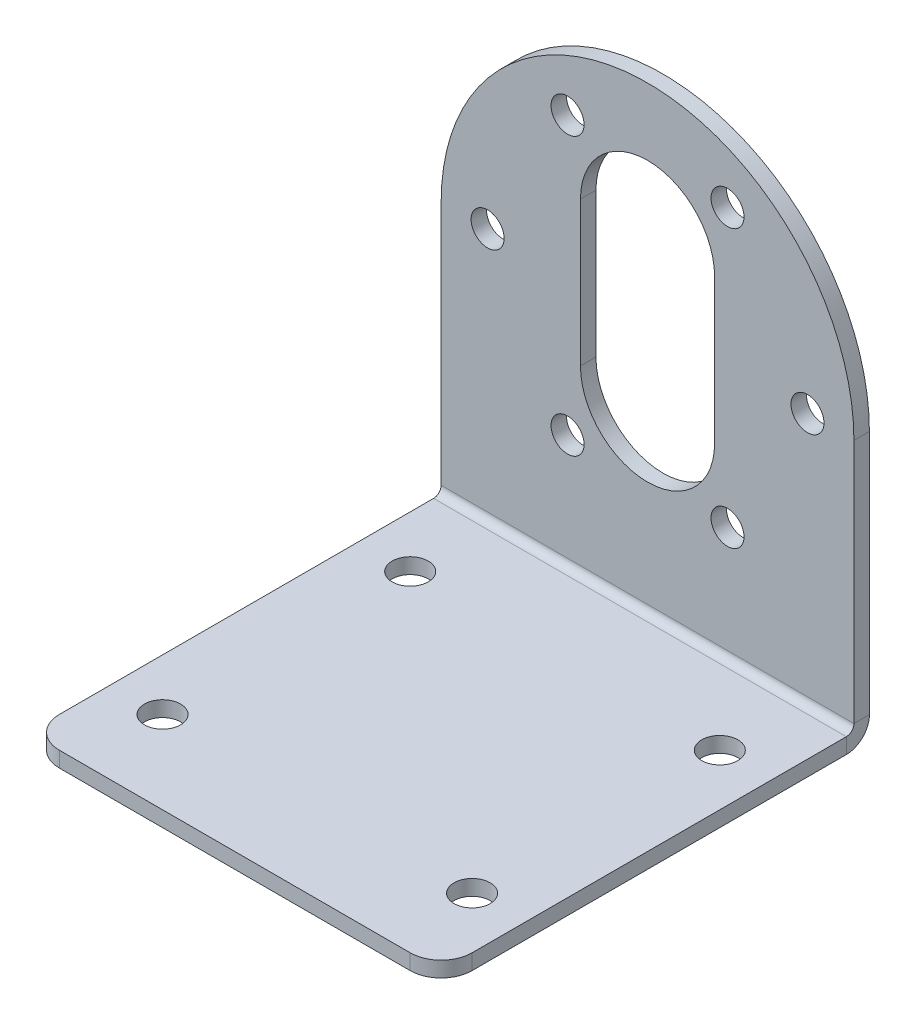
ISO-10303-21;
HEADER;
FILE_DESCRIPTION(('STEP AP214'),'2;1');
FILE_NAME('part.step','',(''),(''),'','','');
FILE_SCHEMA(('AUTOMOTIVE_DESIGN { 1 0 10303 214 1 1 1 1 }'));
ENDSEC;
DATA;
#1=APPLICATION_CONTEXT('core data for automotive mechanical design processes');
#2=APPLICATION_PROTOCOL_DEFINITION('international standard','automotive_design',2000,#1);
#3=PRODUCT_CONTEXT('',#1,'mechanical');
#4=PRODUCT('Part','Part','',(#3));
#5=PRODUCT_RELATED_PRODUCT_CATEGORY('part','',(#4));
#6=PRODUCT_DEFINITION_FORMATION('','',#4);
#7=PRODUCT_DEFINITION_CONTEXT('part definition',#1,'design');
#8=PRODUCT_DEFINITION('design','',#6,#7);
#9=PRODUCT_DEFINITION_SHAPE('','',#8);
#10=(LENGTH_UNIT() NAMED_UNIT(*) SI_UNIT(.MILLI.,.METRE.));
#11=(NAMED_UNIT(*) PLANE_ANGLE_UNIT() SI_UNIT($,.RADIAN.));
#12=(NAMED_UNIT(*) SI_UNIT($,.STERADIAN.) SOLID_ANGLE_UNIT());
#13=UNCERTAINTY_MEASURE_WITH_UNIT(LENGTH_MEASURE(1.E-05),#10,'distance_accuracy_value','');
#14=(GEOMETRIC_REPRESENTATION_CONTEXT(3) GLOBAL_UNCERTAINTY_ASSIGNED_CONTEXT((#13)) GLOBAL_UNIT_ASSIGNED_CONTEXT((#10,
#11,#12)) REPRESENTATION_CONTEXT('',''));
#15=CARTESIAN_POINT('',(0.,0.,0.));
#16=DIRECTION('',(0.,0.,1.));
#17=DIRECTION('',(1.,0.,0.));
#18=AXIS2_PLACEMENT_3D('',#15,#16,#17);
#19=CARTESIAN_POINT('',(0.,0.,-21.5));
#20=DIRECTION('',(0.,0.,1.));
#21=DIRECTION('',(0.,-1.,0.));
#22=AXIS2_PLACEMENT_3D('',#19,#20,#21);
#23=PLANE('',#22);
#24=CARTESIAN_POINT('',(-7.75,37.9233937586588,-21.5000000000001));
#25=DIRECTION('',(0.,0.,-1.));
#26=DIRECTION('',(0.,1.,0.));
#27=AXIS2_PLACEMENT_3D('',#24,#25,#26);
#28=CIRCLE('',#27,1.6);
#29=CARTESIAN_POINT('',(-7.75,39.5233937586588,-21.5000000000001));
#30=VERTEX_POINT('',#29);
#31=EDGE_CURVE('E264',#30,#30,#28,.T.);
#32=ORIENTED_EDGE('',*,*,#31,.F.);
#33=EDGE_LOOP('',(#32));
#34=FACE_BOUND('',#33,.T.);
#35=CARTESIAN_POINT('',(-15.5000000000004,24.5000000000002,-21.5000000000001));
#36=DIRECTION('',(0.,0.,-1.));
#37=DIRECTION('',(0.,1.,0.));
#38=AXIS2_PLACEMENT_3D('',#35,#36,#37);
#39=CIRCLE('',#38,1.6);
#40=CARTESIAN_POINT('',(-15.5000000000004,26.1000000000002,-21.5000000000001));
#41=VERTEX_POINT('',#40);
#42=EDGE_CURVE('E304',#41,#41,#39,.T.);
#43=ORIENTED_EDGE('',*,*,#42,.F.);
#44=EDGE_LOOP('',(#43));
#45=FACE_BOUND('',#44,.T.);
#46=CARTESIAN_POINT('',(-7.75000000000067,11.0766062413411,-21.5));
#47=DIRECTION('',(0.,0.,-1.));
#48=DIRECTION('',(0.,1.,0.));
#49=AXIS2_PLACEMENT_3D('',#46,#47,#48);
#50=CIRCLE('',#49,1.6);
#51=CARTESIAN_POINT('',(-7.75000000000067,12.6766062413411,-21.5));
#52=VERTEX_POINT('',#51);
#53=EDGE_CURVE('E307',#52,#52,#50,.T.);
#54=ORIENTED_EDGE('',*,*,#53,.F.);
#55=EDGE_LOOP('',(#54));
#56=FACE_BOUND('',#55,.T.);
#57=CARTESIAN_POINT('',(7.74999999999937,11.0766062413408,-21.5));
#58=DIRECTION('',(0.,0.,-1.));
#59=DIRECTION('',(0.,1.,0.));
#60=AXIS2_PLACEMENT_3D('',#57,#58,#59);
#61=CIRCLE('',#60,1.6);
#62=CARTESIAN_POINT('',(7.74999999999937,12.6766062413408,-21.5));
#63=VERTEX_POINT('',#62);
#64=EDGE_CURVE('E310',#63,#63,#61,.T.);
#65=ORIENTED_EDGE('',*,*,#64,.F.);
#66=EDGE_LOOP('',(#65));
#67=FACE_BOUND('',#66,.T.);
#68=CARTESIAN_POINT('',(15.4999999999996,24.4999999999995,-21.5000000000001));
#69=DIRECTION('',(0.,0.,-1.));
#70=DIRECTION('',(0.,1.,0.));
#71=AXIS2_PLACEMENT_3D('',#68,#69,#70);
#72=CIRCLE('',#71,1.6);
#73=CARTESIAN_POINT('',(15.4999999999996,26.0999999999995,-21.5000000000001));
#74=VERTEX_POINT('',#73);
#75=EDGE_CURVE('E313',#74,#74,#72,.T.);
#76=ORIENTED_EDGE('',*,*,#75,.F.);
#77=EDGE_LOOP('',(#76));
#78=FACE_BOUND('',#77,.T.);
#79=CARTESIAN_POINT('',(7.74999999999985,37.9233937586585,-21.5000000000001));
#80=DIRECTION('',(0.,0.,-1.));
#81=DIRECTION('',(0.,1.,0.));
#82=AXIS2_PLACEMENT_3D('',#79,#80,#81);
#83=CIRCLE('',#82,1.6);
#84=CARTESIAN_POINT('',(7.74999999999985,39.5233937586585,-21.5000000000001));
#85=VERTEX_POINT('',#84);
#86=EDGE_CURVE('E282',#85,#85,#83,.T.);
#87=ORIENTED_EDGE('',*,*,#86,.F.);
#88=EDGE_LOOP('',(#87));
#89=FACE_BOUND('',#88,.T.);
#90=DIRECTION('',(0.,-1.,0.));
#91=VECTOR('',#90,1.);
#92=CARTESIAN_POINT('',(6.50000000000001,17.5,-21.5000000000001));
#93=LINE('',#92,#91);
#94=CARTESIAN_POINT('',(6.50000000000001,31.5,-21.5000000000001));
#95=VERTEX_POINT('',#94);
#96=CARTESIAN_POINT('',(6.50000000000001,17.5,-21.5000000000001));
#97=VERTEX_POINT('',#96);
#98=EDGE_CURVE('E150',#95,#97,#93,.T.);
#99=ORIENTED_EDGE('',*,*,#98,.F.);
#100=CARTESIAN_POINT('',(0.,31.5,-21.5000000000001));
#101=DIRECTION('',(0.,0.,-1.));
#102=DIRECTION('',(0.,-1.,0.));
#103=AXIS2_PLACEMENT_3D('',#100,#101,#102);
#104=CIRCLE('',#103,6.5);
#105=CARTESIAN_POINT('',(-6.49999999999999,31.5,-21.5000000000001));
#106=VERTEX_POINT('',#105);
#107=EDGE_CURVE('E53',#106,#95,#104,.T.);
#108=ORIENTED_EDGE('',*,*,#107,.F.);
#109=DIRECTION('',(0.,1.,0.));
#110=VECTOR('',#109,1.);
#111=CARTESIAN_POINT('',(-6.49999999999999,17.5,-21.5000000000001));
#112=LINE('',#111,#110);
#113=CARTESIAN_POINT('',(-6.49999999999999,17.5,-21.5000000000001));
#114=VERTEX_POINT('',#113);
#115=EDGE_CURVE('E156',#114,#106,#112,.T.);
#116=ORIENTED_EDGE('',*,*,#115,.F.);
#117=CARTESIAN_POINT('',(0.,17.5,-21.5000000000001));
#118=DIRECTION('',(0.,0.,-1.));
#119=DIRECTION('',(0.,-1.,0.));
#120=AXIS2_PLACEMENT_3D('',#117,#118,#119);
#121=CIRCLE('',#120,6.5);
#122=EDGE_CURVE('E141',#97,#114,#121,.T.);
#123=ORIENTED_EDGE('',*,*,#122,.F.);
#124=EDGE_LOOP('',(#99,#108,#116,#123));
#125=FACE_BOUND('',#124,.T.);
#126=DIRECTION('',(0.,1.,0.));
#127=VECTOR('',#126,1.);
#128=CARTESIAN_POINT('',(-20.,44.5,-21.5000000000001));
#129=LINE('',#128,#127);
#130=CARTESIAN_POINT('',(-20.,0.736600000000007,-21.5));
#131=VERTEX_POINT('',#130);
#132=CARTESIAN_POINT('',(-20.,24.5,-21.5000000000001));
#133=VERTEX_POINT('',#132);
#134=EDGE_CURVE('E189',#131,#133,#129,.T.);
#135=ORIENTED_EDGE('',*,*,#134,.T.);
#136=CARTESIAN_POINT('',(0.,24.5,-21.5000000000001));
#137=DIRECTION('',(0.,0.,1.));
#138=DIRECTION('',(0.,-1.,0.));
#139=AXIS2_PLACEMENT_3D('',#136,#137,#138);
#140=CIRCLE('',#139,20.);
#141=CARTESIAN_POINT('',(20.,24.5,-21.5000000000001));
#142=VERTEX_POINT('',#141);
#143=EDGE_CURVE('E169',#133,#142,#140,.F.);
#144=ORIENTED_EDGE('',*,*,#143,.T.);
#145=DIRECTION('',(0.,-1.,0.));
#146=VECTOR('',#145,1.);
#147=CARTESIAN_POINT('',(20.,0.,-21.5));
#148=LINE('',#147,#146);
#149=CARTESIAN_POINT('',(20.,0.736599999999984,-21.5));
#150=VERTEX_POINT('',#149);
#151=EDGE_CURVE('E187',#142,#150,#148,.T.);
#152=ORIENTED_EDGE('',*,*,#151,.T.);
#153=DIRECTION('',(1.,0.,0.));
#154=VECTOR('',#153,1.);
#155=CARTESIAN_POINT('',(0.,0.736600000000007,-21.5));
#156=LINE('',#155,#154);
#157=EDGE_CURVE('E181',#131,#150,#156,.T.);
#158=ORIENTED_EDGE('',*,*,#157,.F.);
#159=EDGE_LOOP('',(#135,#144,#152,#158));
#160=FACE_BOUND('',#159,.T.);
#161=ADVANCED_FACE('F36',(#34,#45,#56,#67,#78,#89,#125,#160),#23,.F.);
#162=CARTESIAN_POINT('',(0.,0.,-20.));
#163=DIRECTION('',(0.,0.,1.));
#164=DIRECTION('',(0.,-1.,0.));
#165=AXIS2_PLACEMENT_3D('',#162,#163,#164);
#166=PLANE('',#165);
#167=CARTESIAN_POINT('',(-7.75,37.9233937586588,-20.0000000000001));
#168=DIRECTION('',(0.,0.,1.));
#169=DIRECTION('',(0.,-1.,0.));
#170=AXIS2_PLACEMENT_3D('',#167,#168,#169);
#171=CIRCLE('',#170,1.6);
#172=CARTESIAN_POINT('',(-7.75,36.3233937586588,-20.0000000000001));
#173=VERTEX_POINT('',#172);
#174=EDGE_CURVE('E276',#173,#173,#171,.T.);
#175=ORIENTED_EDGE('',*,*,#174,.F.);
#176=EDGE_LOOP('',(#175));
#177=FACE_BOUND('',#176,.T.);
#178=CARTESIAN_POINT('',(-15.5000000000004,24.5000000000002,-20.0000000000001));
#179=DIRECTION('',(0.,0.,1.));
#180=DIRECTION('',(0.,-1.,0.));
#181=AXIS2_PLACEMENT_3D('',#178,#179,#180);
#182=CIRCLE('',#181,1.6);
#183=CARTESIAN_POINT('',(-15.5000000000004,22.9000000000002,-20.0000000000001));
#184=VERTEX_POINT('',#183);
#185=EDGE_CURVE('E273',#184,#184,#182,.T.);
#186=ORIENTED_EDGE('',*,*,#185,.F.);
#187=EDGE_LOOP('',(#186));
#188=FACE_BOUND('',#187,.T.);
#189=CARTESIAN_POINT('',(-7.75000000000067,11.0766062413412,-20.));
#190=DIRECTION('',(0.,0.,1.));
#191=DIRECTION('',(0.,-1.,0.));
#192=AXIS2_PLACEMENT_3D('',#189,#190,#191);
#193=CIRCLE('',#192,1.6);
#194=CARTESIAN_POINT('',(-7.75000000000067,9.47660624134116,-20.));
#195=VERTEX_POINT('',#194);
#196=EDGE_CURVE('E270',#195,#195,#193,.T.);
#197=ORIENTED_EDGE('',*,*,#196,.F.);
#198=EDGE_LOOP('',(#197));
#199=FACE_BOUND('',#198,.T.);
#200=CARTESIAN_POINT('',(7.74999999999937,11.0766062413408,-20.));
#201=DIRECTION('',(0.,0.,1.));
#202=DIRECTION('',(0.,-1.,0.));
#203=AXIS2_PLACEMENT_3D('',#200,#201,#202);
#204=CIRCLE('',#203,1.6);
#205=CARTESIAN_POINT('',(7.74999999999937,9.47660624134083,-20.));
#206=VERTEX_POINT('',#205);
#207=EDGE_CURVE('E267',#206,#206,#204,.T.);
#208=ORIENTED_EDGE('',*,*,#207,.F.);
#209=EDGE_LOOP('',(#208));
#210=FACE_BOUND('',#209,.T.);
#211=CARTESIAN_POINT('',(15.4999999999996,24.4999999999995,-20.0000000000001));
#212=DIRECTION('',(0.,0.,1.));
#213=DIRECTION('',(0.,-1.,0.));
#214=AXIS2_PLACEMENT_3D('',#211,#212,#213);
#215=CIRCLE('',#214,1.6);
#216=CARTESIAN_POINT('',(15.4999999999996,22.8999999999995,-20.0000000000001));
#217=VERTEX_POINT('',#216);
#218=EDGE_CURVE('E263',#217,#217,#215,.T.);
#219=ORIENTED_EDGE('',*,*,#218,.F.);
#220=EDGE_LOOP('',(#219));
#221=FACE_BOUND('',#220,.T.);
#222=CARTESIAN_POINT('',(7.74999999999985,37.9233937586585,-20.0000000000001));
#223=DIRECTION('',(0.,0.,1.));
#224=DIRECTION('',(0.,-1.,0.));
#225=AXIS2_PLACEMENT_3D('',#222,#223,#224);
#226=CIRCLE('',#225,1.6);
#227=CARTESIAN_POINT('',(7.74999999999985,36.3233937586585,-20.0000000000001));
#228=VERTEX_POINT('',#227);
#229=EDGE_CURVE('E260',#228,#228,#226,.T.);
#230=ORIENTED_EDGE('',*,*,#229,.F.);
#231=EDGE_LOOP('',(#230));
#232=FACE_BOUND('',#231,.T.);
#233=CARTESIAN_POINT('',(0.,31.5,-20.0000000000001));
#234=DIRECTION('',(0.,0.,1.));
#235=DIRECTION('',(0.,-1.,0.));
#236=AXIS2_PLACEMENT_3D('',#233,#234,#235);
#237=CIRCLE('',#236,6.5);
#238=CARTESIAN_POINT('',(6.50000000000001,31.5,-20.0000000000001));
#239=VERTEX_POINT('',#238);
#240=CARTESIAN_POINT('',(-6.49999999999999,31.5,-20.0000000000001));
#241=VERTEX_POINT('',#240);
#242=EDGE_CURVE('E11',#239,#241,#237,.T.);
#243=ORIENTED_EDGE('',*,*,#242,.F.);
#244=DIRECTION('',(0.,1.,0.));
#245=VECTOR('',#244,1.);
#246=CARTESIAN_POINT('',(6.50000000000001,0.,-20.));
#247=LINE('',#246,#245);
#248=CARTESIAN_POINT('',(6.50000000000001,17.5,-20.0000000000001));
#249=VERTEX_POINT('',#248);
#250=EDGE_CURVE('E250',#249,#239,#247,.T.);
#251=ORIENTED_EDGE('',*,*,#250,.F.);
#252=CARTESIAN_POINT('',(0.,17.5,-20.0000000000001));
#253=DIRECTION('',(0.,0.,1.));
#254=DIRECTION('',(0.,-1.,0.));
#255=AXIS2_PLACEMENT_3D('',#252,#253,#254);
#256=CIRCLE('',#255,6.5);
#257=CARTESIAN_POINT('',(-6.49999999999999,17.5,-20.));
#258=VERTEX_POINT('',#257);
#259=EDGE_CURVE('E144',#258,#249,#256,.T.);
#260=ORIENTED_EDGE('',*,*,#259,.F.);
#261=DIRECTION('',(0.,-1.,0.));
#262=VECTOR('',#261,1.);
#263=CARTESIAN_POINT('',(-6.49999999999999,0.,-20.));
#264=LINE('',#263,#262);
#265=EDGE_CURVE('E45',#241,#258,#264,.T.);
#266=ORIENTED_EDGE('',*,*,#265,.F.);
#267=EDGE_LOOP('',(#243,#251,#260,#266));
#268=FACE_BOUND('',#267,.T.);
#269=CARTESIAN_POINT('',(0.,24.5,-20.0000000000001));
#270=DIRECTION('',(0.,0.,1.));
#271=DIRECTION('',(0.,-1.,0.));
#272=AXIS2_PLACEMENT_3D('',#269,#270,#271);
#273=CIRCLE('',#272,20.);
#274=CARTESIAN_POINT('',(-20.,24.5,-20.));
#275=VERTEX_POINT('',#274);
#276=CARTESIAN_POINT('',(20.,24.5,-20.0000000000001));
#277=VERTEX_POINT('',#276);
#278=EDGE_CURVE('E168',#275,#277,#273,.F.);
#279=ORIENTED_EDGE('',*,*,#278,.F.);
#280=DIRECTION('',(0.,1.,0.));
#281=VECTOR('',#280,1.);
#282=CARTESIAN_POINT('',(-20.,44.5,-20.0000000000001));
#283=LINE('',#282,#281);
#284=CARTESIAN_POINT('',(-20.,0.736599999999989,-20.));
#285=VERTEX_POINT('',#284);
#286=EDGE_CURVE('E190',#285,#275,#283,.T.);
#287=ORIENTED_EDGE('',*,*,#286,.F.);
#288=DIRECTION('',(-1.,0.,0.));
#289=VECTOR('',#288,1.);
#290=CARTESIAN_POINT('',(20.,0.736599999999997,-20.));
#291=LINE('',#290,#289);
#292=CARTESIAN_POINT('',(20.,0.736599999999989,-20.));
#293=VERTEX_POINT('',#292);
#294=EDGE_CURVE('E176',#293,#285,#291,.T.);
#295=ORIENTED_EDGE('',*,*,#294,.F.);
#296=DIRECTION('',(0.,-1.,0.));
#297=VECTOR('',#296,1.);
#298=CARTESIAN_POINT('',(20.,0.,-20.));
#299=LINE('',#298,#297);
#300=EDGE_CURVE('E186',#277,#293,#299,.T.);
#301=ORIENTED_EDGE('',*,*,#300,.F.);
#302=EDGE_LOOP('',(#279,#287,#295,#301));
#303=FACE_BOUND('',#302,.T.);
#304=ADVANCED_FACE('F322',(#177,#188,#199,#210,#221,#232,#268,#303),#166,.T.);
#305=CARTESIAN_POINT('',(-20.,44.5,-21.5000000000001));
#306=DIRECTION('',(1.,0.,0.));
#307=DIRECTION('',(0.,0.,-1.));
#308=AXIS2_PLACEMENT_3D('',#305,#306,#307);
#309=PLANE('',#308);
#310=DIRECTION('',(0.,0.,1.));
#311=VECTOR('',#310,1.);
#312=CARTESIAN_POINT('',(-20.,24.5,-20.));
#313=LINE('',#312,#311);
#314=EDGE_CURVE('E163',#275,#133,#313,.F.);
#315=ORIENTED_EDGE('',*,*,#314,.T.);
#316=ORIENTED_EDGE('',*,*,#134,.F.);
#317=DIRECTION('',(0.,0.,-1.));
#318=VECTOR('',#317,1.);
#319=CARTESIAN_POINT('',(-20.,0.736599999999997,-20.));
#320=LINE('',#319,#318);
#321=EDGE_CURVE('E178',#285,#131,#320,.T.);
#322=ORIENTED_EDGE('',*,*,#321,.F.);
#323=ORIENTED_EDGE('',*,*,#286,.T.);
#324=EDGE_LOOP('',(#315,#316,#322,#323));
#325=FACE_BOUND('',#324,.T.);
#326=ADVANCED_FACE('F328',(#325),#309,.F.);
#327=CARTESIAN_POINT('',(-20.,-1.5,17.));
#328=DIRECTION('',(-1.,0.,0.));
#329=DIRECTION('',(0.,0.,1.));
#330=AXIS2_PLACEMENT_3D('',#327,#328,#329);
#331=PLANE('',#330);
#332=DIRECTION('',(0.,0.,1.));
#333=VECTOR('',#332,1.);
#334=CARTESIAN_POINT('',(-20.,0.,17.));
#335=LINE('',#334,#333);
#336=CARTESIAN_POINT('',(-20.,0.,-19.2634));
#337=VERTEX_POINT('',#336);
#338=CARTESIAN_POINT('',(-20.,0.,17.));
#339=VERTEX_POINT('',#338);
#340=EDGE_CURVE('E238',#337,#339,#335,.T.);
#341=ORIENTED_EDGE('',*,*,#340,.F.);
#342=DIRECTION('',(0.,-1.,0.));
#343=VECTOR('',#342,1.);
#344=CARTESIAN_POINT('',(-20.,0.,-19.2634));
#345=LINE('',#344,#343);
#346=CARTESIAN_POINT('',(-20.,-1.50000000000001,-19.2634));
#347=VERTEX_POINT('',#346);
#348=EDGE_CURVE('E204',#337,#347,#345,.T.);
#349=ORIENTED_EDGE('',*,*,#348,.T.);
#350=DIRECTION('',(0.,0.,1.));
#351=VECTOR('',#350,1.);
#352=CARTESIAN_POINT('',(-20.,-1.5,17.));
#353=LINE('',#352,#351);
#354=CARTESIAN_POINT('',(-20.,-1.5,17.));
#355=VERTEX_POINT('',#354);
#356=EDGE_CURVE('E223',#347,#355,#353,.T.);
#357=ORIENTED_EDGE('',*,*,#356,.T.);
#358=DIRECTION('',(0.,1.,0.));
#359=VECTOR('',#358,1.);
#360=CARTESIAN_POINT('',(-20.,-1.5,17.));
#361=LINE('',#360,#359);
#362=EDGE_CURVE('E235',#355,#339,#361,.T.);
#363=ORIENTED_EDGE('',*,*,#362,.T.);
#364=EDGE_LOOP('',(#341,#349,#357,#363));
#365=FACE_BOUND('',#364,.T.);
#366=ADVANCED_FACE('F339',(#365),#331,.T.);
#367=CARTESIAN_POINT('',(-17.,-1.5,17.));
#368=DIRECTION('',(0.,-1.,0.));
#369=DIRECTION('',(0.,0.,-1.));
#370=AXIS2_PLACEMENT_3D('',#367,#368,#369);
#371=PLANE('',#370);
#372=CARTESIAN_POINT('',(-15.,-1.5,11.9999999999998));
#373=DIRECTION('',(0.,-1.,0.));
#374=DIRECTION('',(0.,0.,-1.));
#375=AXIS2_PLACEMENT_3D('',#372,#373,#374);
#376=CIRCLE('',#375,1.75);
#377=CARTESIAN_POINT('',(-15.,-1.5,10.2499999999998));
#378=VERTEX_POINT('',#377);
#379=EDGE_CURVE('E287',#378,#378,#376,.T.);
#380=ORIENTED_EDGE('',*,*,#379,.F.);
#381=EDGE_LOOP('',(#380));
#382=FACE_BOUND('',#381,.T.);
#383=CARTESIAN_POINT('',(-14.9999999999997,-1.5,-12.0000000000002));
#384=DIRECTION('',(0.,-1.,0.));
#385=DIRECTION('',(0.,0.,-1.));
#386=AXIS2_PLACEMENT_3D('',#383,#384,#385);
#387=CIRCLE('',#386,1.75);
#388=CARTESIAN_POINT('',(-14.9999999999997,-1.5,-13.7500000000002));
#389=VERTEX_POINT('',#388);
#390=EDGE_CURVE('E705',#389,#389,#387,.T.);
#391=ORIENTED_EDGE('',*,*,#390,.F.);
#392=EDGE_LOOP('',(#391));
#393=FACE_BOUND('',#392,.T.);
#394=CARTESIAN_POINT('',(15.0000000000003,-1.5,-12.));
#395=DIRECTION('',(0.,-1.,0.));
#396=DIRECTION('',(0.,0.,-1.));
#397=AXIS2_PLACEMENT_3D('',#394,#395,#396);
#398=CIRCLE('',#397,1.75);
#399=CARTESIAN_POINT('',(15.0000000000003,-1.5,-13.75));
#400=VERTEX_POINT('',#399);
#401=EDGE_CURVE('E300',#400,#400,#398,.T.);
#402=ORIENTED_EDGE('',*,*,#401,.F.);
#403=EDGE_LOOP('',(#402));
#404=FACE_BOUND('',#403,.T.);
#405=CARTESIAN_POINT('',(15.,-1.5,12.));
#406=DIRECTION('',(0.,-1.,0.));
#407=DIRECTION('',(0.,0.,-1.));
#408=AXIS2_PLACEMENT_3D('',#405,#406,#407);
#409=CIRCLE('',#408,1.75);
#410=CARTESIAN_POINT('',(15.,-1.5,10.25));
#411=VERTEX_POINT('',#410);
#412=EDGE_CURVE('E283',#411,#411,#409,.T.);
#413=ORIENTED_EDGE('',*,*,#412,.F.);
#414=EDGE_LOOP('',(#413));
#415=FACE_BOUND('',#414,.T.);
#416=ORIENTED_EDGE('',*,*,#356,.F.);
#417=DIRECTION('',(-1.,0.,0.));
#418=VECTOR('',#417,1.);
#419=CARTESIAN_POINT('',(-20.,-1.50000000000001,-19.2634));
#420=LINE('',#419,#418);
#421=CARTESIAN_POINT('',(20.,-1.5,-19.2634));
#422=VERTEX_POINT('',#421);
#423=EDGE_CURVE('E197',#347,#422,#420,.F.);
#424=ORIENTED_EDGE('',*,*,#423,.T.);
#425=DIRECTION('',(0.,0.,-1.));
#426=VECTOR('',#425,1.);
#427=CARTESIAN_POINT('',(20.,-1.5,17.));
#428=LINE('',#427,#426);
#429=CARTESIAN_POINT('',(20.,-1.5,17.));
#430=VERTEX_POINT('',#429);
#431=EDGE_CURVE('E220',#430,#422,#428,.T.);
#432=ORIENTED_EDGE('',*,*,#431,.F.);
#433=CARTESIAN_POINT('',(17.,-1.5,17.));
#434=DIRECTION('',(0.,1.,0.));
#435=DIRECTION('',(0.,0.,1.));
#436=AXIS2_PLACEMENT_3D('',#433,#434,#435);
#437=CIRCLE('',#436,3.);
#438=CARTESIAN_POINT('',(17.,-1.5,20.));
#439=VERTEX_POINT('',#438);
#440=EDGE_CURVE('E232',#439,#430,#437,.T.);
#441=ORIENTED_EDGE('',*,*,#440,.F.);
#442=DIRECTION('',(1.,0.,0.));
#443=VECTOR('',#442,1.);
#444=CARTESIAN_POINT('',(-17.,-1.5,20.));
#445=LINE('',#444,#443);
#446=CARTESIAN_POINT('',(-17.,-1.5,20.));
#447=VERTEX_POINT('',#446);
#448=EDGE_CURVE('E229',#447,#439,#445,.T.);
#449=ORIENTED_EDGE('',*,*,#448,.F.);
#450=CARTESIAN_POINT('',(-17.,-1.5,17.));
#451=DIRECTION('',(0.,1.,0.));
#452=DIRECTION('',(0.,0.,-1.));
#453=AXIS2_PLACEMENT_3D('',#450,#451,#452);
#454=CIRCLE('',#453,3.);
#455=EDGE_CURVE('E226',#355,#447,#454,.T.);
#456=ORIENTED_EDGE('',*,*,#455,.F.);
#457=EDGE_LOOP('',(#416,#424,#432,#441,#449,#456));
#458=FACE_BOUND('',#457,.T.);
#459=ADVANCED_FACE('F362',(#382,#393,#404,#415,#458),#371,.T.);
#460=CARTESIAN_POINT('',(-17.,0.,17.));
#461=DIRECTION('',(0.,-1.,0.));
#462=DIRECTION('',(0.,0.,-1.));
#463=AXIS2_PLACEMENT_3D('',#460,#461,#462);
#464=PLANE('',#463);
#465=CARTESIAN_POINT('',(-15.,0.,11.9999999999998));
#466=DIRECTION('',(0.,-1.,0.));
#467=DIRECTION('',(0.,0.,-1.));
#468=AXIS2_PLACEMENT_3D('',#465,#466,#467);
#469=CIRCLE('',#468,1.75);
#470=CARTESIAN_POINT('',(-15.,0.,10.2499999999998));
#471=VERTEX_POINT('',#470);
#472=EDGE_CURVE('E40',#471,#471,#469,.T.);
#473=ORIENTED_EDGE('',*,*,#472,.T.);
#474=EDGE_LOOP('',(#473));
#475=FACE_BOUND('',#474,.T.);
#476=CARTESIAN_POINT('',(-14.9999999999997,0.,-12.0000000000002));
#477=DIRECTION('',(0.,-1.,0.));
#478=DIRECTION('',(0.,0.,-1.));
#479=AXIS2_PLACEMENT_3D('',#476,#477,#478);
#480=CIRCLE('',#479,1.75);
#481=CARTESIAN_POINT('',(-14.9999999999997,0.,-13.7500000000002));
#482=VERTEX_POINT('',#481);
#483=EDGE_CURVE('E286',#482,#482,#480,.T.);
#484=ORIENTED_EDGE('',*,*,#483,.T.);
#485=EDGE_LOOP('',(#484));
#486=FACE_BOUND('',#485,.T.);
#487=CARTESIAN_POINT('',(15.0000000000003,0.,-12.));
#488=DIRECTION('',(0.,-1.,0.));
#489=DIRECTION('',(0.,0.,-1.));
#490=AXIS2_PLACEMENT_3D('',#487,#488,#489);
#491=CIRCLE('',#490,1.75);
#492=CARTESIAN_POINT('',(15.0000000000003,0.,-13.75));
#493=VERTEX_POINT('',#492);
#494=EDGE_CURVE('E284',#493,#493,#491,.T.);
#495=ORIENTED_EDGE('',*,*,#494,.T.);
#496=EDGE_LOOP('',(#495));
#497=FACE_BOUND('',#496,.T.);
#498=CARTESIAN_POINT('',(15.,0.,12.));
#499=DIRECTION('',(0.,-1.,0.));
#500=DIRECTION('',(0.,0.,-1.));
#501=AXIS2_PLACEMENT_3D('',#498,#499,#500);
#502=CIRCLE('',#501,1.75);
#503=CARTESIAN_POINT('',(15.,0.,10.25));
#504=VERTEX_POINT('',#503);
#505=EDGE_CURVE('E279',#504,#504,#502,.T.);
#506=ORIENTED_EDGE('',*,*,#505,.T.);
#507=EDGE_LOOP('',(#506));
#508=FACE_BOUND('',#507,.T.);
#509=DIRECTION('',(-1.,0.,0.));
#510=VECTOR('',#509,1.);
#511=CARTESIAN_POINT('',(-20.,0.,-19.2634));
#512=LINE('',#511,#510);
#513=CARTESIAN_POINT('',(20.,0.,-19.2634));
#514=VERTEX_POINT('',#513);
#515=EDGE_CURVE('E210',#337,#514,#512,.F.);
#516=ORIENTED_EDGE('',*,*,#515,.F.);
#517=ORIENTED_EDGE('',*,*,#340,.T.);
#518=CARTESIAN_POINT('',(-17.,0.,17.));
#519=DIRECTION('',(0.,1.,0.));
#520=DIRECTION('',(0.,0.,-1.));
#521=AXIS2_PLACEMENT_3D('',#518,#519,#520);
#522=CIRCLE('',#521,3.);
#523=CARTESIAN_POINT('',(-17.,0.,20.));
#524=VERTEX_POINT('',#523);
#525=EDGE_CURVE('E240',#339,#524,#522,.T.);
#526=ORIENTED_EDGE('',*,*,#525,.T.);
#527=DIRECTION('',(1.,0.,0.));
#528=VECTOR('',#527,1.);
#529=CARTESIAN_POINT('',(-17.,0.,20.));
#530=LINE('',#529,#528);
#531=CARTESIAN_POINT('',(17.,0.,20.));
#532=VERTEX_POINT('',#531);
#533=EDGE_CURVE('E243',#524,#532,#530,.T.);
#534=ORIENTED_EDGE('',*,*,#533,.T.);
#535=CARTESIAN_POINT('',(17.,0.,17.));
#536=DIRECTION('',(0.,1.,0.));
#537=DIRECTION('',(0.,0.,1.));
#538=AXIS2_PLACEMENT_3D('',#535,#536,#537);
#539=CIRCLE('',#538,3.);
#540=CARTESIAN_POINT('',(20.,0.,17.));
#541=VERTEX_POINT('',#540);
#542=EDGE_CURVE('E224',#532,#541,#539,.T.);
#543=ORIENTED_EDGE('',*,*,#542,.T.);
#544=DIRECTION('',(0.,0.,-1.));
#545=VECTOR('',#544,1.);
#546=CARTESIAN_POINT('',(20.,0.,17.));
#547=LINE('',#546,#545);
#548=EDGE_CURVE('E217',#541,#514,#547,.T.);
#549=ORIENTED_EDGE('',*,*,#548,.T.);
#550=EDGE_LOOP('',(#516,#517,#526,#534,#543,#549));
#551=FACE_BOUND('',#550,.T.);
#552=ADVANCED_FACE('F365',(#475,#486,#497,#508,#551),#464,.F.);
#553=CARTESIAN_POINT('',(20.,-1.5,17.));
#554=DIRECTION('',(1.,0.,0.));
#555=DIRECTION('',(0.,0.,-1.));
#556=AXIS2_PLACEMENT_3D('',#553,#554,#555);
#557=PLANE('',#556);
#558=DIRECTION('',(0.,-1.,0.));
#559=VECTOR('',#558,1.);
#560=CARTESIAN_POINT('',(20.,0.,-19.2634));
#561=LINE('',#560,#559);
#562=EDGE_CURVE('E214',#514,#422,#561,.T.);
#563=ORIENTED_EDGE('',*,*,#562,.F.);
#564=ORIENTED_EDGE('',*,*,#548,.F.);
#565=DIRECTION('',(0.,1.,0.));
#566=VECTOR('',#565,1.);
#567=CARTESIAN_POINT('',(20.,-1.5,17.));
#568=LINE('',#567,#566);
#569=EDGE_CURVE('E248',#430,#541,#568,.T.);
#570=ORIENTED_EDGE('',*,*,#569,.F.);
#571=ORIENTED_EDGE('',*,*,#431,.T.);
#572=EDGE_LOOP('',(#563,#564,#570,#571));
#573=FACE_BOUND('',#572,.T.);
#574=ADVANCED_FACE('F38',(#573),#557,.T.);
#575=CARTESIAN_POINT('',(17.,-1.5,17.));
#576=DIRECTION('',(0.,1.,0.));
#577=DIRECTION('',(0.,0.,1.));
#578=AXIS2_PLACEMENT_3D('',#575,#576,#577);
#579=CYLINDRICAL_SURFACE('',#578,3.);
#580=ORIENTED_EDGE('',*,*,#542,.F.);
#581=DIRECTION('',(0.,1.,0.));
#582=VECTOR('',#581,1.);
#583=CARTESIAN_POINT('',(17.,-1.5,20.));
#584=LINE('',#583,#582);
#585=EDGE_CURVE('E251',#439,#532,#584,.T.);
#586=ORIENTED_EDGE('',*,*,#585,.F.);
#587=ORIENTED_EDGE('',*,*,#440,.T.);
#588=ORIENTED_EDGE('',*,*,#569,.T.);
#589=EDGE_LOOP('',(#580,#586,#587,#588));
#590=FACE_BOUND('',#589,.T.);
#591=ADVANCED_FACE('F369',(#590),#579,.T.);
#592=CARTESIAN_POINT('',(-17.,-1.5,20.));
#593=DIRECTION('',(0.,0.,1.));
#594=DIRECTION('',(1.,0.,0.));
#595=AXIS2_PLACEMENT_3D('',#592,#593,#594);
#596=PLANE('',#595);
#597=ORIENTED_EDGE('',*,*,#533,.F.);
#598=DIRECTION('',(0.,1.,0.));
#599=VECTOR('',#598,1.);
#600=CARTESIAN_POINT('',(-17.,-1.5,20.));
#601=LINE('',#600,#599);
#602=EDGE_CURVE('E253',#447,#524,#601,.T.);
#603=ORIENTED_EDGE('',*,*,#602,.F.);
#604=ORIENTED_EDGE('',*,*,#448,.T.);
#605=ORIENTED_EDGE('',*,*,#585,.T.);
#606=EDGE_LOOP('',(#597,#603,#604,#605));
#607=FACE_BOUND('',#606,.T.);
#608=ADVANCED_FACE('F372',(#607),#596,.T.);
#609=CARTESIAN_POINT('',(-17.,-1.5,17.));
#610=DIRECTION('',(0.,1.,0.));
#611=DIRECTION('',(0.,0.,1.));
#612=AXIS2_PLACEMENT_3D('',#609,#610,#611);
#613=CYLINDRICAL_SURFACE('',#612,3.);
#614=ORIENTED_EDGE('',*,*,#525,.F.);
#615=ORIENTED_EDGE('',*,*,#362,.F.);
#616=ORIENTED_EDGE('',*,*,#455,.T.);
#617=ORIENTED_EDGE('',*,*,#602,.T.);
#618=EDGE_LOOP('',(#614,#615,#616,#617));
#619=FACE_BOUND('',#618,.T.);
#620=ADVANCED_FACE('F357',(#619),#613,.T.);
#621=CARTESIAN_POINT('',(20.,0.736599999999992,-19.2634));
#622=DIRECTION('',(1.,0.,0.));
#623=DIRECTION('',(0.,0.,-1.));
#624=AXIS2_PLACEMENT_3D('',#621,#622,#623);
#625=PLANE('',#624);
#626=DIRECTION('',(0.,0.,-1.));
#627=VECTOR('',#626,1.);
#628=CARTESIAN_POINT('',(20.,0.736599999999997,-20.));
#629=LINE('',#628,#627);
#630=EDGE_CURVE('E175',#293,#150,#629,.T.);
#631=ORIENTED_EDGE('',*,*,#630,.F.);
#632=CARTESIAN_POINT('',(20.,0.736599999999992,-19.2634));
#633=DIRECTION('',(-1.,0.,0.));
#634=DIRECTION('',(0.,0.,1.));
#635=AXIS2_PLACEMENT_3D('',#632,#633,#634);
#636=CIRCLE('',#635,0.7366);
#637=EDGE_CURVE('E207',#514,#293,#636,.F.);
#638=ORIENTED_EDGE('',*,*,#637,.F.);
#639=ORIENTED_EDGE('',*,*,#562,.T.);
#640=CARTESIAN_POINT('',(20.,0.736599999999992,-19.2634));
#641=DIRECTION('',(-1.,0.,0.));
#642=DIRECTION('',(0.,0.,1.));
#643=AXIS2_PLACEMENT_3D('',#640,#641,#642);
#644=CIRCLE('',#643,2.2366);
#645=EDGE_CURVE('E200',#422,#150,#644,.F.);
#646=ORIENTED_EDGE('',*,*,#645,.T.);
#647=EDGE_LOOP('',(#631,#638,#639,#646));
#648=FACE_BOUND('',#647,.T.);
#649=ADVANCED_FACE('F354',(#648),#625,.T.);
#650=CARTESIAN_POINT('',(-20.,0.736599999999992,-19.2634));
#651=DIRECTION('',(1.,0.,0.));
#652=DIRECTION('',(0.,0.,-1.));
#653=AXIS2_PLACEMENT_3D('',#650,#651,#652);
#654=PLANE('',#653);
#655=CARTESIAN_POINT('',(-20.,0.736599999999992,-19.2634));
#656=DIRECTION('',(-1.,0.,0.));
#657=DIRECTION('',(0.,0.,1.));
#658=AXIS2_PLACEMENT_3D('',#655,#656,#657);
#659=CIRCLE('',#658,0.7366);
#660=EDGE_CURVE('E193',#285,#337,#659,.T.);
#661=ORIENTED_EDGE('',*,*,#660,.F.);
#662=ORIENTED_EDGE('',*,*,#321,.T.);
#663=CARTESIAN_POINT('',(-20.,0.736599999999992,-19.2634));
#664=DIRECTION('',(-1.,0.,0.));
#665=DIRECTION('',(0.,0.,1.));
#666=AXIS2_PLACEMENT_3D('',#663,#664,#665);
#667=CIRCLE('',#666,2.2366);
#668=EDGE_CURVE('E201',#131,#347,#667,.T.);
#669=ORIENTED_EDGE('',*,*,#668,.T.);
#670=ORIENTED_EDGE('',*,*,#348,.F.);
#671=EDGE_LOOP('',(#661,#662,#669,#670));
#672=FACE_BOUND('',#671,.T.);
#673=ADVANCED_FACE('F349',(#672),#654,.F.);
#674=CARTESIAN_POINT('',(-20.,0.736599999999992,-19.2634));
#675=DIRECTION('',(-1.,0.,0.));
#676=DIRECTION('',(0.,0.,-1.));
#677=AXIS2_PLACEMENT_3D('',#674,#675,#676);
#678=CYLINDRICAL_SURFACE('',#677,2.2366);
#679=ORIENTED_EDGE('',*,*,#423,.F.);
#680=ORIENTED_EDGE('',*,*,#668,.F.);
#681=ORIENTED_EDGE('',*,*,#157,.T.);
#682=ORIENTED_EDGE('',*,*,#645,.F.);
#683=EDGE_LOOP('',(#679,#680,#681,#682));
#684=FACE_BOUND('',#683,.T.);
#685=ADVANCED_FACE('F346',(#684),#678,.T.);
#686=CARTESIAN_POINT('',(-20.,0.736599999999992,-19.2634));
#687=DIRECTION('',(-1.,0.,0.));
#688=DIRECTION('',(0.,0.,-1.));
#689=AXIS2_PLACEMENT_3D('',#686,#687,#688);
#690=CYLINDRICAL_SURFACE('',#689,0.7366);
#691=ORIENTED_EDGE('',*,*,#515,.T.);
#692=ORIENTED_EDGE('',*,*,#637,.T.);
#693=ORIENTED_EDGE('',*,*,#294,.T.);
#694=ORIENTED_EDGE('',*,*,#660,.T.);
#695=EDGE_LOOP('',(#691,#692,#693,#694));
#696=FACE_BOUND('',#695,.T.);
#697=ADVANCED_FACE('F344',(#696),#690,.F.);
#698=CARTESIAN_POINT('',(20.,0.,-21.5));
#699=DIRECTION('',(-1.,0.,0.));
#700=DIRECTION('',(0.,0.,1.));
#701=AXIS2_PLACEMENT_3D('',#698,#699,#700);
#702=PLANE('',#701);
#703=ORIENTED_EDGE('',*,*,#151,.F.);
#704=DIRECTION('',(0.,0.,1.));
#705=VECTOR('',#704,1.);
#706=CARTESIAN_POINT('',(20.,24.5,-20.0000000000001));
#707=LINE('',#706,#705);
#708=EDGE_CURVE('E172',#277,#142,#707,.F.);
#709=ORIENTED_EDGE('',*,*,#708,.F.);
#710=ORIENTED_EDGE('',*,*,#300,.T.);
#711=ORIENTED_EDGE('',*,*,#630,.T.);
#712=EDGE_LOOP('',(#703,#709,#710,#711));
#713=FACE_BOUND('',#712,.T.);
#714=ADVANCED_FACE('F341',(#713),#702,.F.);
#715=CARTESIAN_POINT('',(0.,24.5,-20.0000000000001));
#716=DIRECTION('',(0.,0.,1.));
#717=DIRECTION('',(0.,-1.,0.));
#718=AXIS2_PLACEMENT_3D('',#715,#716,#717);
#719=CYLINDRICAL_SURFACE('',#718,20.);
#720=ORIENTED_EDGE('',*,*,#278,.T.);
#721=ORIENTED_EDGE('',*,*,#708,.T.);
#722=ORIENTED_EDGE('',*,*,#143,.F.);
#723=ORIENTED_EDGE('',*,*,#314,.F.);
#724=EDGE_LOOP('',(#720,#721,#722,#723));
#725=FACE_BOUND('',#724,.T.);
#726=ADVANCED_FACE('F334',(#725),#719,.T.);
#727=CARTESIAN_POINT('',(0.,31.5,-11.5000000000001));
#728=DIRECTION('',(0.,0.,-1.));
#729=DIRECTION('',(0.,1.,0.));
#730=AXIS2_PLACEMENT_3D('',#727,#728,#729);
#731=CYLINDRICAL_SURFACE('',#730,6.5);
#732=ORIENTED_EDGE('',*,*,#242,.T.);
#733=DIRECTION('',(0.,0.,-1.));
#734=VECTOR('',#733,1.);
#735=CARTESIAN_POINT('',(-6.49999999999999,31.5,-11.5000000000001));
#736=LINE('',#735,#734);
#737=EDGE_CURVE('E161',#241,#106,#736,.T.);
#738=ORIENTED_EDGE('',*,*,#737,.T.);
#739=ORIENTED_EDGE('',*,*,#107,.T.);
#740=DIRECTION('',(0.,0.,-1.));
#741=VECTOR('',#740,1.);
#742=CARTESIAN_POINT('',(6.50000000000001,31.5,-11.5000000000001));
#743=LINE('',#742,#741);
#744=EDGE_CURVE('E147',#239,#95,#743,.T.);
#745=ORIENTED_EDGE('',*,*,#744,.F.);
#746=EDGE_LOOP('',(#732,#738,#739,#745));
#747=FACE_BOUND('',#746,.T.);
#748=ADVANCED_FACE('F456',(#747),#731,.F.);
#749=CARTESIAN_POINT('',(-6.49999999999999,17.5,-11.5000000000001));
#750=DIRECTION('',(-1.,0.,0.));
#751=DIRECTION('',(0.,0.,1.));
#752=AXIS2_PLACEMENT_3D('',#749,#750,#751);
#753=PLANE('',#752);
#754=ORIENTED_EDGE('',*,*,#265,.T.);
#755=DIRECTION('',(0.,0.,-1.));
#756=VECTOR('',#755,1.);
#757=CARTESIAN_POINT('',(-6.49999999999999,17.5,-11.5000000000001));
#758=LINE('',#757,#756);
#759=EDGE_CURVE('E146',#258,#114,#758,.T.);
#760=ORIENTED_EDGE('',*,*,#759,.T.);
#761=ORIENTED_EDGE('',*,*,#115,.T.);
#762=ORIENTED_EDGE('',*,*,#737,.F.);
#763=EDGE_LOOP('',(#754,#760,#761,#762));
#764=FACE_BOUND('',#763,.T.);
#765=ADVANCED_FACE('F463',(#764),#753,.F.);
#766=CARTESIAN_POINT('',(0.,17.5,-11.5000000000001));
#767=DIRECTION('',(0.,0.,-1.));
#768=DIRECTION('',(0.,1.,0.));
#769=AXIS2_PLACEMENT_3D('',#766,#767,#768);
#770=CYLINDRICAL_SURFACE('',#769,6.5);
#771=ORIENTED_EDGE('',*,*,#259,.T.);
#772=DIRECTION('',(0.,0.,-1.));
#773=VECTOR('',#772,1.);
#774=CARTESIAN_POINT('',(6.50000000000001,17.5,-11.5000000000001));
#775=LINE('',#774,#773);
#776=EDGE_CURVE('E61',#249,#97,#775,.T.);
#777=ORIENTED_EDGE('',*,*,#776,.T.);
#778=ORIENTED_EDGE('',*,*,#122,.T.);
#779=ORIENTED_EDGE('',*,*,#759,.F.);
#780=EDGE_LOOP('',(#771,#777,#778,#779));
#781=FACE_BOUND('',#780,.T.);
#782=ADVANCED_FACE('F138',(#781),#770,.F.);
#783=CARTESIAN_POINT('',(6.50000000000001,17.5,-11.5000000000001));
#784=DIRECTION('',(1.,0.,0.));
#785=DIRECTION('',(0.,0.,-1.));
#786=AXIS2_PLACEMENT_3D('',#783,#784,#785);
#787=PLANE('',#786);
#788=ORIENTED_EDGE('',*,*,#250,.T.);
#789=ORIENTED_EDGE('',*,*,#744,.T.);
#790=ORIENTED_EDGE('',*,*,#98,.T.);
#791=ORIENTED_EDGE('',*,*,#776,.F.);
#792=EDGE_LOOP('',(#788,#789,#790,#791));
#793=FACE_BOUND('',#792,.T.);
#794=ADVANCED_FACE('F151',(#793),#787,.F.);
#795=CARTESIAN_POINT('',(7.74999999999985,37.9233937586585,-11.5000000000001));
#796=DIRECTION('',(0.,0.,-1.));
#797=DIRECTION('',(0.,1.,0.));
#798=AXIS2_PLACEMENT_3D('',#795,#796,#797);
#799=CYLINDRICAL_SURFACE('',#798,1.6);
#800=ORIENTED_EDGE('',*,*,#229,.T.);
#801=EDGE_LOOP('',(#800));
#802=FACE_BOUND('',#801,.T.);
#803=ORIENTED_EDGE('',*,*,#86,.T.);
#804=EDGE_LOOP('',(#803));
#805=FACE_BOUND('',#804,.T.);
#806=ADVANCED_FACE('F319',(#802,#805),#799,.F.);
#807=CARTESIAN_POINT('',(15.4999999999996,24.4999999999995,-11.5000000000001));
#808=DIRECTION('',(0.,0.,-1.));
#809=DIRECTION('',(0.,1.,0.));
#810=AXIS2_PLACEMENT_3D('',#807,#808,#809);
#811=CYLINDRICAL_SURFACE('',#810,1.6);
#812=ORIENTED_EDGE('',*,*,#218,.T.);
#813=EDGE_LOOP('',(#812));
#814=FACE_BOUND('',#813,.T.);
#815=ORIENTED_EDGE('',*,*,#75,.T.);
#816=EDGE_LOOP('',(#815));
#817=FACE_BOUND('',#816,.T.);
#818=ADVANCED_FACE('F489',(#814,#817),#811,.F.);
#819=CARTESIAN_POINT('',(7.74999999999937,11.0766062413409,-11.5));
#820=DIRECTION('',(0.,0.,-1.));
#821=DIRECTION('',(0.,1.,0.));
#822=AXIS2_PLACEMENT_3D('',#819,#820,#821);
#823=CYLINDRICAL_SURFACE('',#822,1.6);
#824=ORIENTED_EDGE('',*,*,#207,.T.);
#825=EDGE_LOOP('',(#824));
#826=FACE_BOUND('',#825,.T.);
#827=ORIENTED_EDGE('',*,*,#64,.T.);
#828=EDGE_LOOP('',(#827));
#829=FACE_BOUND('',#828,.T.);
#830=ADVANCED_FACE('F497',(#826,#829),#823,.F.);
#831=CARTESIAN_POINT('',(-7.75000000000067,11.0766062413412,-11.5));
#832=DIRECTION('',(0.,0.,-1.));
#833=DIRECTION('',(0.,1.,0.));
#834=AXIS2_PLACEMENT_3D('',#831,#832,#833);
#835=CYLINDRICAL_SURFACE('',#834,1.6);
#836=ORIENTED_EDGE('',*,*,#196,.T.);
#837=EDGE_LOOP('',(#836));
#838=FACE_BOUND('',#837,.T.);
#839=ORIENTED_EDGE('',*,*,#53,.T.);
#840=EDGE_LOOP('',(#839));
#841=FACE_BOUND('',#840,.T.);
#842=ADVANCED_FACE('F505',(#838,#841),#835,.F.);
#843=CARTESIAN_POINT('',(-15.5000000000004,24.5000000000002,-11.5000000000001));
#844=DIRECTION('',(0.,0.,-1.));
#845=DIRECTION('',(0.,1.,0.));
#846=AXIS2_PLACEMENT_3D('',#843,#844,#845);
#847=CYLINDRICAL_SURFACE('',#846,1.6);
#848=ORIENTED_EDGE('',*,*,#185,.T.);
#849=EDGE_LOOP('',(#848));
#850=FACE_BOUND('',#849,.T.);
#851=ORIENTED_EDGE('',*,*,#42,.T.);
#852=EDGE_LOOP('',(#851));
#853=FACE_BOUND('',#852,.T.);
#854=ADVANCED_FACE('F513',(#850,#853),#847,.F.);
#855=CARTESIAN_POINT('',(-7.75,37.9233937586588,-11.5000000000001));
#856=DIRECTION('',(0.,0.,-1.));
#857=DIRECTION('',(0.,1.,0.));
#858=AXIS2_PLACEMENT_3D('',#855,#856,#857);
#859=CYLINDRICAL_SURFACE('',#858,1.6);
#860=ORIENTED_EDGE('',*,*,#174,.T.);
#861=EDGE_LOOP('',(#860));
#862=FACE_BOUND('',#861,.T.);
#863=ORIENTED_EDGE('',*,*,#31,.T.);
#864=EDGE_LOOP('',(#863));
#865=FACE_BOUND('',#864,.T.);
#866=ADVANCED_FACE('F521',(#862,#865),#859,.F.);
#867=CARTESIAN_POINT('',(15.,8.5,12.));
#868=DIRECTION('',(0.,-1.,0.));
#869=DIRECTION('',(0.,0.,-1.));
#870=AXIS2_PLACEMENT_3D('',#867,#868,#869);
#871=CYLINDRICAL_SURFACE('',#870,1.75);
#872=ORIENTED_EDGE('',*,*,#412,.T.);
#873=EDGE_LOOP('',(#872));
#874=FACE_BOUND('',#873,.T.);
#875=ORIENTED_EDGE('',*,*,#505,.F.);
#876=EDGE_LOOP('',(#875));
#877=FACE_BOUND('',#876,.T.);
#878=ADVANCED_FACE('F529',(#874,#877),#871,.F.);
#879=CARTESIAN_POINT('',(15.0000000000003,8.5,-12.));
#880=DIRECTION('',(0.,-1.,0.));
#881=DIRECTION('',(0.,0.,-1.));
#882=AXIS2_PLACEMENT_3D('',#879,#880,#881);
#883=CYLINDRICAL_SURFACE('',#882,1.75);
#884=ORIENTED_EDGE('',*,*,#401,.T.);
#885=EDGE_LOOP('',(#884));
#886=FACE_BOUND('',#885,.T.);
#887=ORIENTED_EDGE('',*,*,#494,.F.);
#888=EDGE_LOOP('',(#887));
#889=FACE_BOUND('',#888,.T.);
#890=ADVANCED_FACE('F538',(#886,#889),#883,.F.);
#891=CARTESIAN_POINT('',(-14.9999999999997,8.5,-12.0000000000002));
#892=DIRECTION('',(0.,-1.,0.));
#893=DIRECTION('',(0.,0.,-1.));
#894=AXIS2_PLACEMENT_3D('',#891,#892,#893);
#895=CYLINDRICAL_SURFACE('',#894,1.75);
#896=ORIENTED_EDGE('',*,*,#390,.T.);
#897=EDGE_LOOP('',(#896));
#898=FACE_BOUND('',#897,.T.);
#899=ORIENTED_EDGE('',*,*,#483,.F.);
#900=EDGE_LOOP('',(#899));
#901=FACE_BOUND('',#900,.T.);
#902=ADVANCED_FACE('F545',(#898,#901),#895,.F.);
#903=CARTESIAN_POINT('',(-15.,8.5,11.9999999999998));
#904=DIRECTION('',(0.,-1.,0.));
#905=DIRECTION('',(0.,0.,-1.));
#906=AXIS2_PLACEMENT_3D('',#903,#904,#905);
#907=CYLINDRICAL_SURFACE('',#906,1.75);
#908=ORIENTED_EDGE('',*,*,#379,.T.);
#909=EDGE_LOOP('',(#908));
#910=FACE_BOUND('',#909,.T.);
#911=ORIENTED_EDGE('',*,*,#472,.F.);
#912=EDGE_LOOP('',(#911));
#913=FACE_BOUND('',#912,.T.);
#914=ADVANCED_FACE('F553',(#910,#913),#907,.F.);
#915=CLOSED_SHELL('',(#161,#304,#326,#366,#459,#552,#574,#591,#608,#620,#649,#673,#685,#697,
#714,#726,#748,#765,#782,#794,#806,#818,#830,#842,#854,#866,#878,#890,#902,#914));
#916=MANIFOLD_SOLID_BREP('B2',#915);
#917=ADVANCED_BREP_SHAPE_REPRESENTATION('',(#18,#916),#14);
#918=SHAPE_DEFINITION_REPRESENTATION(#9,#917);
ENDSEC;
END-ISO-10303-21;
